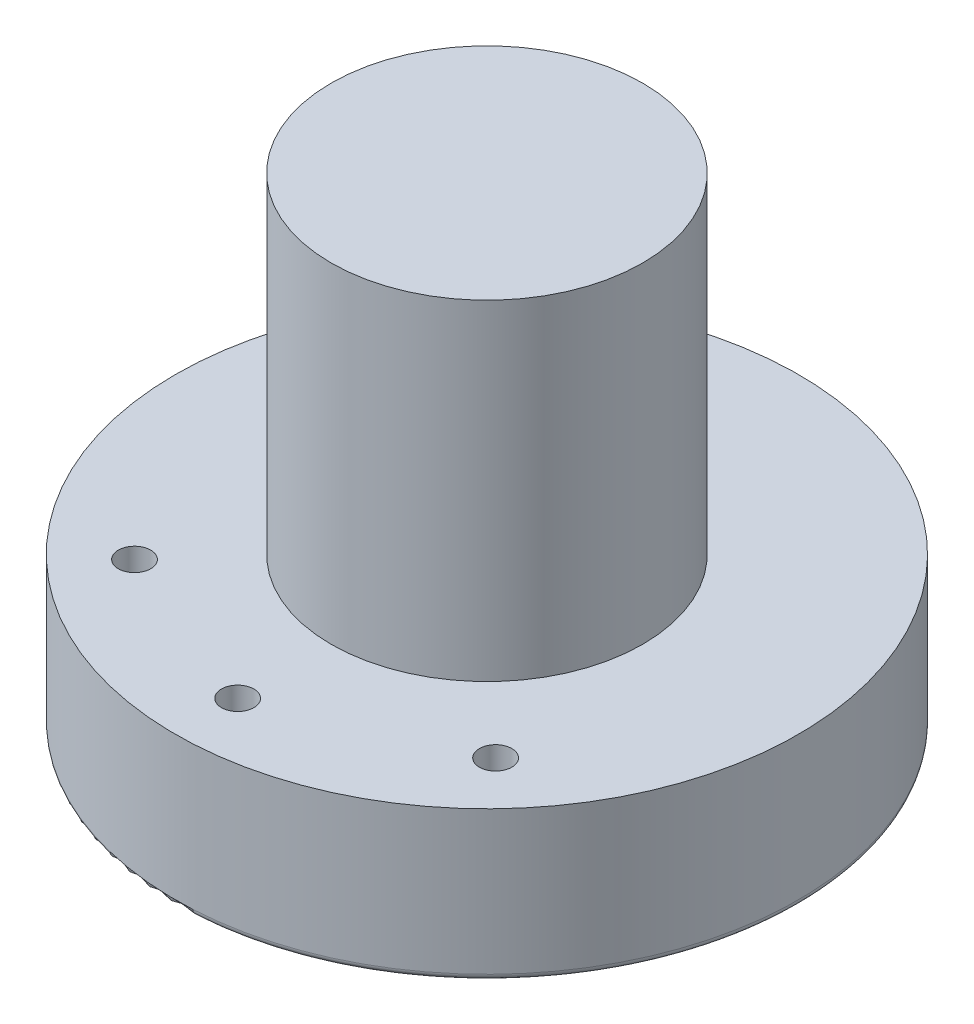
ISO-10303-21;
HEADER;
FILE_DESCRIPTION(('STEP AP214'),'2;1');
FILE_NAME('part.step','',(''),(''),'','','');
FILE_SCHEMA(('AUTOMOTIVE_DESIGN { 1 0 10303 214 1 1 1 1 }'));
ENDSEC;
DATA;
#1=APPLICATION_CONTEXT('core data for automotive mechanical design processes');
#2=APPLICATION_PROTOCOL_DEFINITION('international standard','automotive_design',2000,#1);
#3=PRODUCT_CONTEXT('',#1,'mechanical');
#4=PRODUCT('Part','Part','',(#3));
#5=PRODUCT_RELATED_PRODUCT_CATEGORY('part','',(#4));
#6=PRODUCT_DEFINITION_FORMATION('','',#4);
#7=PRODUCT_DEFINITION_CONTEXT('part definition',#1,'design');
#8=PRODUCT_DEFINITION('design','',#6,#7);
#9=PRODUCT_DEFINITION_SHAPE('','',#8);
#10=(LENGTH_UNIT() NAMED_UNIT(*) SI_UNIT(.MILLI.,.METRE.));
#11=(NAMED_UNIT(*) PLANE_ANGLE_UNIT() SI_UNIT($,.RADIAN.));
#12=(NAMED_UNIT(*) SI_UNIT($,.STERADIAN.) SOLID_ANGLE_UNIT());
#13=UNCERTAINTY_MEASURE_WITH_UNIT(LENGTH_MEASURE(1.E-05),#10,'distance_accuracy_value','');
#14=(GEOMETRIC_REPRESENTATION_CONTEXT(3) GLOBAL_UNCERTAINTY_ASSIGNED_CONTEXT((#13)) GLOBAL_UNIT_ASSIGNED_CONTEXT((#10,
#11,#12)) REPRESENTATION_CONTEXT('',''));
#15=CARTESIAN_POINT('',(0.,0.,0.));
#16=DIRECTION('',(0.,0.,1.));
#17=DIRECTION('',(1.,0.,0.));
#18=AXIS2_PLACEMENT_3D('',#15,#16,#17);
#19=CARTESIAN_POINT('',(0.,0.,0.));
#20=DIRECTION('',(0.,1.,0.));
#21=DIRECTION('',(-1.,0.,0.));
#22=AXIS2_PLACEMENT_3D('',#19,#20,#21);
#23=PLANE('',#22);
#24=CARTESIAN_POINT('',(0.,0.,0.));
#25=DIRECTION('',(0.,1.,0.));
#26=DIRECTION('',(-1.,0.,0.));
#27=AXIS2_PLACEMENT_3D('',#24,#25,#26);
#28=CIRCLE('',#27,5.5);
#29=CARTESIAN_POINT('',(-5.5,0.,0.));
#30=VERTEX_POINT('',#29);
#31=EDGE_CURVE('E10',#30,#30,#28,.F.);
#32=ORIENTED_EDGE('',*,*,#31,.T.);
#33=EDGE_LOOP('',(#32));
#34=FACE_BOUND('',#33,.T.);
#35=ADVANCED_FACE('F43',(#34),#23,.F.);
#36=CARTESIAN_POINT('',(0.,40.,0.));
#37=DIRECTION('',(0.,1.,0.));
#38=DIRECTION('',(-1.,0.,0.));
#39=AXIS2_PLACEMENT_3D('',#36,#37,#38);
#40=CYLINDRICAL_SURFACE('',#39,6.);
#41=CARTESIAN_POINT('',(0.,0.5,0.));
#42=DIRECTION('',(0.,1.,0.));
#43=DIRECTION('',(-1.,0.,0.));
#44=AXIS2_PLACEMENT_3D('',#41,#42,#43);
#45=CIRCLE('',#44,6.);
#46=CARTESIAN_POINT('',(-6.,0.5,0.));
#47=VERTEX_POINT('',#46);
#48=EDGE_CURVE('E51',#47,#47,#45,.T.);
#49=ORIENTED_EDGE('',*,*,#48,.T.);
#50=EDGE_LOOP('',(#49));
#51=FACE_BOUND('',#50,.T.);
#52=CARTESIAN_POINT('',(0.,1.5,0.));
#53=DIRECTION('',(0.,1.,0.));
#54=DIRECTION('',(-1.,0.,0.));
#55=AXIS2_PLACEMENT_3D('',#52,#53,#54);
#56=CIRCLE('',#55,6.);
#57=CARTESIAN_POINT('',(-6.,1.5,0.));
#58=VERTEX_POINT('',#57);
#59=EDGE_CURVE('E67',#58,#58,#56,.T.);
#60=ORIENTED_EDGE('',*,*,#59,.F.);
#61=EDGE_LOOP('',(#60));
#62=FACE_BOUND('',#61,.T.);
#63=ADVANCED_FACE('F134',(#51,#62),#40,.T.);
#64=CARTESIAN_POINT('',(6.,1.5,0.));
#65=DIRECTION('',(0.,1.,0.));
#66=DIRECTION('',(-1.,0.,0.));
#67=AXIS2_PLACEMENT_3D('',#64,#65,#66);
#68=PLANE('',#67);
#69=CARTESIAN_POINT('',(14.4860706677614,1.5,13.7896249625804));
#70=DIRECTION('',(0.,1.,0.));
#71=DIRECTION('',(-1.,0.,0.));
#72=AXIS2_PLACEMENT_3D('',#69,#70,#71);
#73=CIRCLE('',#72,1.3);
#74=CARTESIAN_POINT('',(13.1860706677614,1.5,13.7896249625804));
#75=VERTEX_POINT('',#74);
#76=EDGE_CURVE('E99',#75,#75,#73,.T.);
#77=ORIENTED_EDGE('',*,*,#76,.T.);
#78=EDGE_LOOP('',(#77));
#79=FACE_BOUND('',#78,.T.);
#80=CARTESIAN_POINT('',(0.,1.5,20.));
#81=DIRECTION('',(0.,1.,0.));
#82=DIRECTION('',(-1.,0.,0.));
#83=AXIS2_PLACEMENT_3D('',#80,#81,#82);
#84=CIRCLE('',#83,1.3);
#85=CARTESIAN_POINT('',(-1.3,1.5,20.));
#86=VERTEX_POINT('',#85);
#87=EDGE_CURVE('E91',#86,#86,#84,.T.);
#88=ORIENTED_EDGE('',*,*,#87,.T.);
#89=EDGE_LOOP('',(#88));
#90=FACE_BOUND('',#89,.T.);
#91=CARTESIAN_POINT('',(-13.7896249625805,1.5,14.4860706677614));
#92=DIRECTION('',(0.,1.,0.));
#93=DIRECTION('',(-1.,0.,0.));
#94=AXIS2_PLACEMENT_3D('',#91,#92,#93);
#95=CIRCLE('',#94,1.3);
#96=CARTESIAN_POINT('',(-15.0896249625805,1.5,14.4860706677614));
#97=VERTEX_POINT('',#96);
#98=EDGE_CURVE('E83',#97,#97,#95,.T.);
#99=ORIENTED_EDGE('',*,*,#98,.T.);
#100=EDGE_LOOP('',(#99));
#101=FACE_BOUND('',#100,.T.);
#102=CARTESIAN_POINT('',(0.,1.5,0.));
#103=DIRECTION('',(0.,1.,0.));
#104=DIRECTION('',(-1.,0.,0.));
#105=AXIS2_PLACEMENT_3D('',#102,#103,#104);
#106=CIRCLE('',#105,24.5);
#107=CARTESIAN_POINT('',(-24.5,1.5,0.));
#108=VERTEX_POINT('',#107);
#109=EDGE_CURVE('E56',#108,#108,#106,.F.);
#110=ORIENTED_EDGE('',*,*,#109,.T.);
#111=EDGE_LOOP('',(#110));
#112=FACE_BOUND('',#111,.T.);
#113=ORIENTED_EDGE('',*,*,#59,.T.);
#114=EDGE_LOOP('',(#113));
#115=FACE_BOUND('',#114,.T.);
#116=ADVANCED_FACE('F126',(#79,#90,#101,#112,#115),#68,.F.);
#117=CARTESIAN_POINT('',(0.,40.,0.));
#118=DIRECTION('',(0.,1.,0.));
#119=DIRECTION('',(-1.,0.,0.));
#120=AXIS2_PLACEMENT_3D('',#117,#118,#119);
#121=CYLINDRICAL_SURFACE('',#120,25.);
#122=CARTESIAN_POINT('',(0.,2.,0.));
#123=DIRECTION('',(0.,1.,0.));
#124=DIRECTION('',(-1.,0.,0.));
#125=AXIS2_PLACEMENT_3D('',#122,#123,#124);
#126=CIRCLE('',#125,25.);
#127=CARTESIAN_POINT('',(-25.,2.,0.));
#128=VERTEX_POINT('',#127);
#129=EDGE_CURVE('E61',#128,#128,#126,.T.);
#130=ORIENTED_EDGE('',*,*,#129,.T.);
#131=EDGE_LOOP('',(#130));
#132=FACE_BOUND('',#131,.T.);
#133=CARTESIAN_POINT('',(0.,13.5,0.));
#134=DIRECTION('',(0.,1.,0.));
#135=DIRECTION('',(-1.,0.,0.));
#136=AXIS2_PLACEMENT_3D('',#133,#134,#135);
#137=CIRCLE('',#136,25.);
#138=CARTESIAN_POINT('',(-25.,13.5,0.));
#139=VERTEX_POINT('',#138);
#140=EDGE_CURVE('E71',#139,#139,#137,.T.);
#141=ORIENTED_EDGE('',*,*,#140,.F.);
#142=EDGE_LOOP('',(#141));
#143=FACE_BOUND('',#142,.T.);
#144=ADVANCED_FACE('F115',(#132,#143),#121,.T.);
#145=CARTESIAN_POINT('',(25.,13.5,0.));
#146=DIRECTION('',(0.,-1.,0.));
#147=DIRECTION('',(1.,0.,0.));
#148=AXIS2_PLACEMENT_3D('',#145,#146,#147);
#149=PLANE('',#148);
#150=CARTESIAN_POINT('',(14.4860706677614,13.5,13.7896249625804));
#151=DIRECTION('',(0.,1.,0.));
#152=DIRECTION('',(0.,0.,1.));
#153=AXIS2_PLACEMENT_3D('',#150,#151,#152);
#154=CIRCLE('',#153,1.3);
#155=CARTESIAN_POINT('',(14.4860706677614,13.5,15.0896249625804));
#156=VERTEX_POINT('',#155);
#157=EDGE_CURVE('E103',#156,#156,#154,.T.);
#158=ORIENTED_EDGE('',*,*,#157,.F.);
#159=EDGE_LOOP('',(#158));
#160=FACE_BOUND('',#159,.T.);
#161=CARTESIAN_POINT('',(0.,13.5,20.));
#162=DIRECTION('',(0.,1.,0.));
#163=DIRECTION('',(0.,0.,1.));
#164=AXIS2_PLACEMENT_3D('',#161,#162,#163);
#165=CIRCLE('',#164,1.3);
#166=CARTESIAN_POINT('',(0.,13.5,21.3));
#167=VERTEX_POINT('',#166);
#168=EDGE_CURVE('E95',#167,#167,#165,.T.);
#169=ORIENTED_EDGE('',*,*,#168,.F.);
#170=EDGE_LOOP('',(#169));
#171=FACE_BOUND('',#170,.T.);
#172=CARTESIAN_POINT('',(-13.7896249625805,13.5,14.4860706677614));
#173=DIRECTION('',(0.,1.,0.));
#174=DIRECTION('',(0.,0.,1.));
#175=AXIS2_PLACEMENT_3D('',#172,#173,#174);
#176=CIRCLE('',#175,1.3);
#177=CARTESIAN_POINT('',(-13.7896249625805,13.5,15.7860706677614));
#178=VERTEX_POINT('',#177);
#179=EDGE_CURVE('E87',#178,#178,#176,.T.);
#180=ORIENTED_EDGE('',*,*,#179,.F.);
#181=EDGE_LOOP('',(#180));
#182=FACE_BOUND('',#181,.T.);
#183=CARTESIAN_POINT('',(0.,13.5,0.));
#184=DIRECTION('',(0.,1.,0.));
#185=DIRECTION('',(-1.,0.,0.));
#186=AXIS2_PLACEMENT_3D('',#183,#184,#185);
#187=CIRCLE('',#186,12.5);
#188=CARTESIAN_POINT('',(-12.5,13.5,0.));
#189=VERTEX_POINT('',#188);
#190=EDGE_CURVE('E75',#189,#189,#187,.T.);
#191=ORIENTED_EDGE('',*,*,#190,.F.);
#192=EDGE_LOOP('',(#191));
#193=FACE_BOUND('',#192,.T.);
#194=ORIENTED_EDGE('',*,*,#140,.T.);
#195=EDGE_LOOP('',(#194));
#196=FACE_BOUND('',#195,.T.);
#197=ADVANCED_FACE('F111',(#160,#171,#182,#193,#196),#149,.F.);
#198=CARTESIAN_POINT('',(0.,40.,0.));
#199=DIRECTION('',(0.,1.,0.));
#200=DIRECTION('',(-1.,0.,0.));
#201=AXIS2_PLACEMENT_3D('',#198,#199,#200);
#202=CYLINDRICAL_SURFACE('',#201,12.5);
#203=CARTESIAN_POINT('',(0.,40.,0.));
#204=DIRECTION('',(0.,1.,0.));
#205=DIRECTION('',(-1.,0.,0.));
#206=AXIS2_PLACEMENT_3D('',#203,#204,#205);
#207=CIRCLE('',#206,12.5);
#208=CARTESIAN_POINT('',(-12.5,40.,0.));
#209=VERTEX_POINT('',#208);
#210=EDGE_CURVE('E79',#209,#209,#207,.T.);
#211=ORIENTED_EDGE('',*,*,#210,.F.);
#212=EDGE_LOOP('',(#211));
#213=FACE_BOUND('',#212,.T.);
#214=ORIENTED_EDGE('',*,*,#190,.T.);
#215=EDGE_LOOP('',(#214));
#216=FACE_BOUND('',#215,.T.);
#217=ADVANCED_FACE('F114',(#213,#216),#202,.T.);
#218=CARTESIAN_POINT('',(12.5,40.,0.));
#219=DIRECTION('',(0.,-1.,0.));
#220=DIRECTION('',(1.,0.,0.));
#221=AXIS2_PLACEMENT_3D('',#218,#219,#220);
#222=PLANE('',#221);
#223=ORIENTED_EDGE('',*,*,#210,.T.);
#224=EDGE_LOOP('',(#223));
#225=FACE_BOUND('',#224,.T.);
#226=ADVANCED_FACE('F144',(#225),#222,.F.);
#227=CARTESIAN_POINT('',(0.,2.,0.));
#228=DIRECTION('',(0.,1.,0.));
#229=DIRECTION('',(-1.,0.,0.));
#230=AXIS2_PLACEMENT_3D('',#227,#228,#229);
#231=TOROIDAL_SURFACE('',#230,24.5,0.5);
#232=ORIENTED_EDGE('',*,*,#109,.F.);
#233=EDGE_LOOP('',(#232));
#234=FACE_BOUND('',#233,.T.);
#235=ORIENTED_EDGE('',*,*,#129,.F.);
#236=EDGE_LOOP('',(#235));
#237=FACE_BOUND('',#236,.T.);
#238=ADVANCED_FACE('F143',(#234,#237),#231,.T.);
#239=CARTESIAN_POINT('',(0.,0.5,0.));
#240=DIRECTION('',(0.,1.,0.));
#241=DIRECTION('',(-1.,0.,0.));
#242=AXIS2_PLACEMENT_3D('',#239,#240,#241);
#243=TOROIDAL_SURFACE('',#242,5.5,0.5);
#244=ORIENTED_EDGE('',*,*,#31,.F.);
#245=EDGE_LOOP('',(#244));
#246=FACE_BOUND('',#245,.T.);
#247=ORIENTED_EDGE('',*,*,#48,.F.);
#248=EDGE_LOOP('',(#247));
#249=FACE_BOUND('',#248,.T.);
#250=ADVANCED_FACE('F45',(#246,#249),#243,.T.);
#251=CARTESIAN_POINT('',(-13.7896249625805,13.5,14.4860706677614));
#252=DIRECTION('',(0.,1.,0.));
#253=DIRECTION('',(0.,0.,1.));
#254=AXIS2_PLACEMENT_3D('',#251,#252,#253);
#255=CYLINDRICAL_SURFACE('',#254,1.3);
#256=ORIENTED_EDGE('',*,*,#179,.T.);
#257=EDGE_LOOP('',(#256));
#258=FACE_BOUND('',#257,.T.);
#259=ORIENTED_EDGE('',*,*,#98,.F.);
#260=EDGE_LOOP('',(#259));
#261=FACE_BOUND('',#260,.T.);
#262=ADVANCED_FACE('F149',(#258,#261),#255,.F.);
#263=CARTESIAN_POINT('',(0.,13.5,20.));
#264=DIRECTION('',(0.,1.,0.));
#265=DIRECTION('',(0.,0.,1.));
#266=AXIS2_PLACEMENT_3D('',#263,#264,#265);
#267=CYLINDRICAL_SURFACE('',#266,1.3);
#268=ORIENTED_EDGE('',*,*,#168,.T.);
#269=EDGE_LOOP('',(#268));
#270=FACE_BOUND('',#269,.T.);
#271=ORIENTED_EDGE('',*,*,#87,.F.);
#272=EDGE_LOOP('',(#271));
#273=FACE_BOUND('',#272,.T.);
#274=ADVANCED_FACE('F168',(#270,#273),#267,.F.);
#275=CARTESIAN_POINT('',(14.4860706677614,13.5,13.7896249625804));
#276=DIRECTION('',(0.,1.,0.));
#277=DIRECTION('',(0.,0.,1.));
#278=AXIS2_PLACEMENT_3D('',#275,#276,#277);
#279=CYLINDRICAL_SURFACE('',#278,1.3);
#280=ORIENTED_EDGE('',*,*,#157,.T.);
#281=EDGE_LOOP('',(#280));
#282=FACE_BOUND('',#281,.T.);
#283=ORIENTED_EDGE('',*,*,#76,.F.);
#284=EDGE_LOOP('',(#283));
#285=FACE_BOUND('',#284,.T.);
#286=ADVANCED_FACE('F108',(#282,#285),#279,.F.);
#287=CLOSED_SHELL('',(#35,#63,#116,#144,#197,#217,#226,#238,#250,#262,#274,#286));
#288=MANIFOLD_SOLID_BREP('B2',#287);
#289=ADVANCED_BREP_SHAPE_REPRESENTATION('',(#18,#288),#14);
#290=SHAPE_DEFINITION_REPRESENTATION(#9,#289);
ENDSEC;
END-ISO-10303-21;
